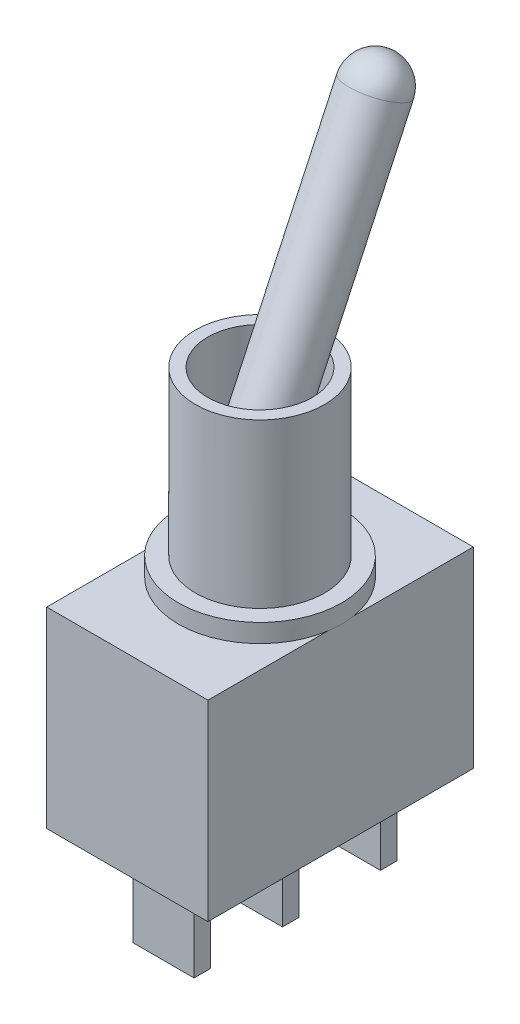
ISO-10303-21;
HEADER;
FILE_DESCRIPTION(('STEP AP214'),'2;1');
FILE_NAME('part.step','',(''),(''),'','','');
FILE_SCHEMA(('AUTOMOTIVE_DESIGN { 1 0 10303 214 1 1 1 1 }'));
ENDSEC;
DATA;
#1=APPLICATION_CONTEXT('core data for automotive mechanical design processes');
#2=APPLICATION_PROTOCOL_DEFINITION('international standard','automotive_design',2000,#1);
#3=PRODUCT_CONTEXT('',#1,'mechanical');
#4=PRODUCT('Part','Part','',(#3));
#5=PRODUCT_RELATED_PRODUCT_CATEGORY('part','',(#4));
#6=PRODUCT_DEFINITION_FORMATION('','',#4);
#7=PRODUCT_DEFINITION_CONTEXT('part definition',#1,'design');
#8=PRODUCT_DEFINITION('design','',#6,#7);
#9=PRODUCT_DEFINITION_SHAPE('','',#8);
#10=(LENGTH_UNIT() NAMED_UNIT(*) SI_UNIT(.MILLI.,.METRE.));
#11=(NAMED_UNIT(*) PLANE_ANGLE_UNIT() SI_UNIT($,.RADIAN.));
#12=(NAMED_UNIT(*) SI_UNIT($,.STERADIAN.) SOLID_ANGLE_UNIT());
#13=UNCERTAINTY_MEASURE_WITH_UNIT(LENGTH_MEASURE(1.E-05),#10,'distance_accuracy_value','');
#14=(GEOMETRIC_REPRESENTATION_CONTEXT(3) GLOBAL_UNCERTAINTY_ASSIGNED_CONTEXT((#13)) GLOBAL_UNIT_ASSIGNED_CONTEXT((#10,
#11,#12)) REPRESENTATION_CONTEXT('',''));
#15=CARTESIAN_POINT('',(0.,0.,0.));
#16=DIRECTION('',(0.,0.,1.));
#17=DIRECTION('',(1.,0.,0.));
#18=AXIS2_PLACEMENT_3D('',#15,#16,#17);
#19=CARTESIAN_POINT('',(0.,-10.3,0.));
#20=DIRECTION('',(0.,1.,0.));
#21=DIRECTION('',(0.,0.,1.));
#22=AXIS2_PLACEMENT_3D('',#19,#20,#21);
#23=PLANE('',#22);
#24=DIRECTION('',(0.,0.,1.));
#25=VECTOR('',#24,1.);
#26=CARTESIAN_POINT('',(1.5,-10.3,0.4));
#27=LINE('',#26,#25);
#28=CARTESIAN_POINT('',(1.5,-10.3,-0.4));
#29=VERTEX_POINT('',#28);
#30=CARTESIAN_POINT('',(1.5,-10.3,0.4));
#31=VERTEX_POINT('',#30);
#32=EDGE_CURVE('E223',#29,#31,#27,.T.);
#33=ORIENTED_EDGE('',*,*,#32,.F.);
#34=DIRECTION('',(1.,0.,0.));
#35=VECTOR('',#34,1.);
#36=CARTESIAN_POINT('',(-1.5,-10.3,-0.4));
#37=LINE('',#36,#35);
#38=CARTESIAN_POINT('',(-1.5,-10.3,-0.4));
#39=VERTEX_POINT('',#38);
#40=EDGE_CURVE('E228',#39,#29,#37,.T.);
#41=ORIENTED_EDGE('',*,*,#40,.F.);
#42=DIRECTION('',(0.,0.,-1.));
#43=VECTOR('',#42,1.);
#44=CARTESIAN_POINT('',(-1.5,-10.3,0.4));
#45=LINE('',#44,#43);
#46=CARTESIAN_POINT('',(-1.5,-10.3,0.4));
#47=VERTEX_POINT('',#46);
#48=EDGE_CURVE('E240',#47,#39,#45,.T.);
#49=ORIENTED_EDGE('',*,*,#48,.F.);
#50=DIRECTION('',(-1.,0.,0.));
#51=VECTOR('',#50,1.);
#52=CARTESIAN_POINT('',(-1.5,-10.3,0.4));
#53=LINE('',#52,#51);
#54=EDGE_CURVE('E237',#31,#47,#53,.T.);
#55=ORIENTED_EDGE('',*,*,#54,.F.);
#56=EDGE_LOOP('',(#33,#41,#49,#55));
#57=FACE_BOUND('',#56,.T.);
#58=DIRECTION('',(0.,0.,-1.));
#59=VECTOR('',#58,1.);
#60=CARTESIAN_POINT('',(-3.95,-10.3,6.5));
#61=LINE('',#60,#59);
#62=CARTESIAN_POINT('',(-3.95,-10.3,6.5));
#63=VERTEX_POINT('',#62);
#64=CARTESIAN_POINT('',(-3.95,-10.3,-6.5));
#65=VERTEX_POINT('',#64);
#66=EDGE_CURVE('E290',#63,#65,#61,.T.);
#67=ORIENTED_EDGE('',*,*,#66,.T.);
#68=DIRECTION('',(1.,0.,0.));
#69=VECTOR('',#68,1.);
#70=CARTESIAN_POINT('',(3.95,-10.3,-6.5));
#71=LINE('',#70,#69);
#72=CARTESIAN_POINT('',(3.95,-10.3,-6.5));
#73=VERTEX_POINT('',#72);
#74=EDGE_CURVE('E293',#65,#73,#71,.T.);
#75=ORIENTED_EDGE('',*,*,#74,.T.);
#76=DIRECTION('',(0.,0.,1.));
#77=VECTOR('',#76,1.);
#78=CARTESIAN_POINT('',(3.95,-10.3,6.5));
#79=LINE('',#78,#77);
#80=CARTESIAN_POINT('',(3.95,-10.3,6.5));
#81=VERTEX_POINT('',#80);
#82=EDGE_CURVE('E296',#73,#81,#79,.T.);
#83=ORIENTED_EDGE('',*,*,#82,.T.);
#84=DIRECTION('',(-1.,0.,0.));
#85=VECTOR('',#84,1.);
#86=CARTESIAN_POINT('',(3.95,-10.3,6.5));
#87=LINE('',#86,#85);
#88=EDGE_CURVE('E298',#81,#63,#87,.T.);
#89=ORIENTED_EDGE('',*,*,#88,.T.);
#90=EDGE_LOOP('',(#67,#75,#83,#89));
#91=FACE_BOUND('',#90,.T.);
#92=DIRECTION('',(0.,0.,1.));
#93=VECTOR('',#92,1.);
#94=CARTESIAN_POINT('',(1.5,-10.3,4.73035239529269));
#95=LINE('',#94,#93);
#96=CARTESIAN_POINT('',(1.5,-10.3,3.93035239529269));
#97=VERTEX_POINT('',#96);
#98=CARTESIAN_POINT('',(1.5,-10.3,4.73035239529269));
#99=VERTEX_POINT('',#98);
#100=EDGE_CURVE('E256',#97,#99,#95,.T.);
#101=ORIENTED_EDGE('',*,*,#100,.F.);
#102=DIRECTION('',(1.,0.,0.));
#103=VECTOR('',#102,1.);
#104=CARTESIAN_POINT('',(-1.5,-10.3,3.93035239529269));
#105=LINE('',#104,#103);
#106=CARTESIAN_POINT('',(-1.5,-10.3,3.93035239529269));
#107=VERTEX_POINT('',#106);
#108=EDGE_CURVE('E261',#107,#97,#105,.T.);
#109=ORIENTED_EDGE('',*,*,#108,.F.);
#110=DIRECTION('',(0.,0.,-1.));
#111=VECTOR('',#110,1.);
#112=CARTESIAN_POINT('',(-1.5,-10.3,4.73035239529269));
#113=LINE('',#112,#111);
#114=CARTESIAN_POINT('',(-1.5,-10.3,4.73035239529269));
#115=VERTEX_POINT('',#114);
#116=EDGE_CURVE('E273',#115,#107,#113,.T.);
#117=ORIENTED_EDGE('',*,*,#116,.F.);
#118=DIRECTION('',(-1.,0.,0.));
#119=VECTOR('',#118,1.);
#120=CARTESIAN_POINT('',(-1.5,-10.3,4.73035239529269));
#121=LINE('',#120,#119);
#122=EDGE_CURVE('E270',#99,#115,#121,.T.);
#123=ORIENTED_EDGE('',*,*,#122,.F.);
#124=EDGE_LOOP('',(#101,#109,#117,#123));
#125=FACE_BOUND('',#124,.T.);
#126=DIRECTION('',(0.,0.,1.));
#127=VECTOR('',#126,1.);
#128=CARTESIAN_POINT('',(1.5,-10.3,-4.40180205123181));
#129=LINE('',#128,#127);
#130=CARTESIAN_POINT('',(1.5,-10.3,-5.20180205123181));
#131=VERTEX_POINT('',#130);
#132=CARTESIAN_POINT('',(1.5,-10.3,-4.40180205123181));
#133=VERTEX_POINT('',#132);
#134=EDGE_CURVE('E177',#131,#133,#129,.T.);
#135=ORIENTED_EDGE('',*,*,#134,.F.);
#136=DIRECTION('',(1.,0.,0.));
#137=VECTOR('',#136,1.);
#138=CARTESIAN_POINT('',(-1.5,-10.3,-5.20180205123181));
#139=LINE('',#138,#137);
#140=CARTESIAN_POINT('',(-1.5,-10.3,-5.20180205123181));
#141=VERTEX_POINT('',#140);
#142=EDGE_CURVE('E198',#141,#131,#139,.T.);
#143=ORIENTED_EDGE('',*,*,#142,.F.);
#144=DIRECTION('',(0.,0.,-1.));
#145=VECTOR('',#144,1.);
#146=CARTESIAN_POINT('',(-1.5,-10.3,-4.40180205123181));
#147=LINE('',#146,#145);
#148=CARTESIAN_POINT('',(-1.5,-10.3,-4.40180205123181));
#149=VERTEX_POINT('',#148);
#150=EDGE_CURVE('E208',#149,#141,#147,.T.);
#151=ORIENTED_EDGE('',*,*,#150,.F.);
#152=DIRECTION('',(-1.,0.,0.));
#153=VECTOR('',#152,1.);
#154=CARTESIAN_POINT('',(-1.5,-10.3,-4.40180205123181));
#155=LINE('',#154,#153);
#156=EDGE_CURVE('E58',#133,#149,#155,.T.);
#157=ORIENTED_EDGE('',*,*,#156,.F.);
#158=EDGE_LOOP('',(#135,#143,#151,#157));
#159=FACE_BOUND('',#158,.T.);
#160=ADVANCED_FACE('F33',(#57,#91,#125,#159),#23,.F.);
#161=CARTESIAN_POINT('',(0.,-0.9,0.));
#162=DIRECTION('',(0.,-1.,0.));
#163=DIRECTION('',(0.,0.,-1.));
#164=AXIS2_PLACEMENT_3D('',#161,#162,#163);
#165=PLANE('',#164);
#166=DIRECTION('',(0.,0.,-1.));
#167=VECTOR('',#166,1.);
#168=CARTESIAN_POINT('',(-3.95,-0.9,6.5));
#169=LINE('',#168,#167);
#170=CARTESIAN_POINT('',(-3.95,-0.9,0.630476010645933));
#171=VERTEX_POINT('',#170);
#172=CARTESIAN_POINT('',(-3.95,-0.9,-0.630476010645934));
#173=VERTEX_POINT('',#172);
#174=EDGE_CURVE('E46',#171,#173,#169,.T.);
#175=ORIENTED_EDGE('',*,*,#174,.F.);
#176=CARTESIAN_POINT('',(0.,-0.9,0.));
#177=DIRECTION('',(0.,-1.,0.));
#178=DIRECTION('',(0.,0.,-1.));
#179=AXIS2_PLACEMENT_3D('',#176,#177,#178);
#180=CIRCLE('',#179,4.);
#181=EDGE_CURVE('E371',#171,#173,#180,.T.);
#182=ORIENTED_EDGE('',*,*,#181,.T.);
#183=EDGE_LOOP('',(#175,#182));
#184=FACE_BOUND('',#183,.T.);
#185=ADVANCED_FACE('F373',(#184),#165,.T.);
#186=CARTESIAN_POINT('',(0.,8.,0.));
#187=DIRECTION('',(0.,1.,0.));
#188=DIRECTION('',(0.,0.,1.));
#189=AXIS2_PLACEMENT_3D('',#186,#187,#188);
#190=PLANE('',#189);
#191=CARTESIAN_POINT('',(0.,8.,-1.398922974465));
#192=DIRECTION('',(0.,1.,0.));
#193=DIRECTION('',(0.,0.,-1.));
#194=AXIS2_PLACEMENT_3D('',#191,#192,#193);
#195=ELLIPSE('',#194,1.54472908654749,1.4);
#196=CARTESIAN_POINT('',(1.1394630748505,8.,-2.29641351806512));
#197=VERTEX_POINT('',#196);
#198=CARTESIAN_POINT('',(-1.1394630748505,8.,-2.29641351806512));
#199=VERTEX_POINT('',#198);
#200=EDGE_CURVE('E173',#197,#199,#195,.T.);
#201=ORIENTED_EDGE('',*,*,#200,.F.);
#202=CARTESIAN_POINT('',(0.,8.,0.));
#203=DIRECTION('',(0.,1.,0.));
#204=DIRECTION('',(0.,0.,1.));
#205=AXIS2_PLACEMENT_3D('',#202,#203,#204);
#206=CIRCLE('',#205,2.56357);
#207=EDGE_CURVE('E164',#199,#197,#206,.T.);
#208=ORIENTED_EDGE('',*,*,#207,.F.);
#209=EDGE_LOOP('',(#201,#208));
#210=FACE_BOUND('',#209,.T.);
#211=CARTESIAN_POINT('',(0.,8.,0.));
#212=DIRECTION('',(0.,1.,0.));
#213=DIRECTION('',(0.,0.,1.));
#214=AXIS2_PLACEMENT_3D('',#211,#212,#213);
#215=CIRCLE('',#214,3.16357);
#216=CARTESIAN_POINT('',(0.,8.,3.16357));
#217=VERTEX_POINT('',#216);
#218=EDGE_CURVE('E170',#217,#217,#215,.T.);
#219=ORIENTED_EDGE('',*,*,#218,.T.);
#220=EDGE_LOOP('',(#219));
#221=FACE_BOUND('',#220,.T.);
#222=ADVANCED_FACE('F174',(#210,#221),#190,.T.);
#223=CARTESIAN_POINT('',(0.,8.,0.));
#224=DIRECTION('',(0.,-1.,0.));
#225=DIRECTION('',(0.,0.,-1.));
#226=AXIS2_PLACEMENT_3D('',#223,#224,#225);
#227=CYLINDRICAL_SURFACE('',#226,3.16357);
#228=ORIENTED_EDGE('',*,*,#218,.F.);
#229=EDGE_LOOP('',(#228));
#230=FACE_BOUND('',#229,.T.);
#231=CARTESIAN_POINT('',(0.,0.,0.));
#232=DIRECTION('',(0.,-1.,0.));
#233=DIRECTION('',(0.,0.,-1.));
#234=AXIS2_PLACEMENT_3D('',#231,#232,#233);
#235=CIRCLE('',#234,3.16357);
#236=CARTESIAN_POINT('',(0.,0.,-3.16357));
#237=VERTEX_POINT('',#236);
#238=EDGE_CURVE('E326',#237,#237,#235,.T.);
#239=ORIENTED_EDGE('',*,*,#238,.F.);
#240=EDGE_LOOP('',(#239));
#241=FACE_BOUND('',#240,.T.);
#242=ADVANCED_FACE('F35',(#230,#241),#227,.T.);
#243=CARTESIAN_POINT('',(0.,8.,0.));
#244=DIRECTION('',(0.,-1.,0.));
#245=DIRECTION('',(0.,0.,-1.));
#246=AXIS2_PLACEMENT_3D('',#243,#244,#245);
#247=CYLINDRICAL_SURFACE('',#246,2.56357);
#248=CARTESIAN_POINT('',(-1.1394630748505,8.,-2.29641351806512));
#249=CARTESIAN_POINT('',(-1.12226827270815,7.96131736444431,-2.30493857180161));
#250=CARTESIAN_POINT('',(-1.1038901049141,7.92324768718584,-2.31382414280397));
#251=CARTESIAN_POINT('',(-1.06449779961533,7.84856342761104,-2.33221271820831));
#252=CARTESIAN_POINT('',(-1.04347888558669,7.81195164445421,-2.34171682600029));
#253=CARTESIAN_POINT('',(-0.975888177283611,7.70443228135152,-2.37106811798166));
#254=CARTESIAN_POINT('',(-0.924982479903859,7.63631125852949,-2.39164933037791));
#255=CARTESIAN_POINT('',(-0.822750588776976,7.52404485299656,-2.42842927129518));
#256=CARTESIAN_POINT('',(-0.773682329704692,7.47785340580067,-2.44465528273487));
#257=CARTESIAN_POINT('',(-0.668282249814375,7.39428761935084,-2.47553808822086));
#258=CARTESIAN_POINT('',(-0.611973766582887,7.3568859977715,-2.4901996585817));
#259=CARTESIAN_POINT('',(-0.492651350690235,7.29209095592104,-2.51653260863014));
#260=CARTESIAN_POINT('',(-0.429593131800477,7.26476961658452,-2.52818228066054));
#261=CARTESIAN_POINT('',(-0.298934411756676,7.22168109448528,-2.54693468283132));
#262=CARTESIAN_POINT('',(-0.231331757682915,7.20591943081837,-2.55403524082097));
#263=CARTESIAN_POINT('',(-0.101244553737832,7.18763783241573,-2.56231181247647));
#264=CARTESIAN_POINT('',(-0.0389615866485444,7.18390826368347,-2.56402850596738));
#265=CARTESIAN_POINT('',(0.0853546419817216,7.18637387954013,-2.56290159565313));
#266=CARTESIAN_POINT('',(0.147387977670522,7.19256585925628,-2.56005946444571));
#267=CARTESIAN_POINT('',(0.267241713805259,7.21428742966118,-2.550287960424));
#268=CARTESIAN_POINT('',(0.325133640688882,7.22949067868386,-2.54350158719142));
#269=CARTESIAN_POINT('',(0.43737718429277,7.26846162830131,-2.52662087880715));
#270=CARTESIAN_POINT('',(0.491731613502875,7.29222242452199,-2.51652921101604));
#271=CARTESIAN_POINT('',(0.59740466204986,7.34842368661777,-2.49359552704039));
#272=CARTESIAN_POINT('',(0.648571336836085,7.38111662399594,-2.48067611197517));
#273=CARTESIAN_POINT('',(0.745210715742571,7.45380329299459,-2.45338268669338));
#274=CARTESIAN_POINT('',(0.7906651676326,7.4938194718231,-2.43900426642421));
#275=CARTESIAN_POINT('',(0.865682818583732,7.56994866706548,-2.41323019808421));
#276=CARTESIAN_POINT('',(0.896504537293593,7.60486613126359,-2.40190323988882));
#277=CARTESIAN_POINT('',(0.954552395104911,7.67769281295424,-2.37943055055159));
#278=CARTESIAN_POINT('',(0.98177409056439,7.71560563725052,-2.36828505800089));
#279=CARTESIAN_POINT('',(1.03258939096979,7.79359889290867,-2.34657488886693));
#280=CARTESIAN_POINT('',(1.05620275030308,7.83366576947291,-2.33600726939871));
#281=CARTESIAN_POINT('',(1.10018002224675,7.91558765327592,-2.31561373800405));
#282=CARTESIAN_POINT('',(1.12055239636047,7.95743763016402,-2.30578593118771));
#283=CARTESIAN_POINT('',(1.1394630748505,8.00000000000001,-2.29641351806513));
#284=B_SPLINE_CURVE_WITH_KNOTS('',3,(#248,#249,#250,#251,#252,#253,#254,#255,#256,#257,#258,
#259,#260,#261,#262,#263,#264,#265,#266,#267,#268,#269,#270,#271,#272,#273,#274,#275,#276,#277,
#278,#279,#280,#281,#282,#283),.UNSPECIFIED.,.F.,.F.,(4,2,2,2,2,2,2,2,2,2,2,2,2,2,2,2,2,4),(0.,
0.129498195126758,0.259234090174244,0.520256731569084,0.727373709878902,0.933839076916279,
1.14175344261752,1.34976701124116,1.53608508293887,1.72234298203871,1.90223557452442,
2.08198335057287,2.26745929183861,2.45351357766242,2.59707917217262,2.74082035316078,
2.88374399835837,3.0262881504681),.UNSPECIFIED.);
#285=EDGE_CURVE('E11',#199,#197,#284,.T.);
#286=ORIENTED_EDGE('',*,*,#285,.F.);
#287=ORIENTED_EDGE('',*,*,#207,.T.);
#288=EDGE_LOOP('',(#286,#287));
#289=FACE_BOUND('',#288,.T.);
#290=CARTESIAN_POINT('',(0.,0.,0.));
#291=DIRECTION('',(0.,1.,0.));
#292=DIRECTION('',(0.,0.,1.));
#293=AXIS2_PLACEMENT_3D('',#290,#291,#292);
#294=CIRCLE('',#293,2.56357);
#295=CARTESIAN_POINT('',(0.,0.,2.56357));
#296=VERTEX_POINT('',#295);
#297=EDGE_CURVE('E171',#296,#296,#294,.T.);
#298=ORIENTED_EDGE('',*,*,#297,.F.);
#299=EDGE_LOOP('',(#298));
#300=FACE_BOUND('',#299,.T.);
#301=ADVANCED_FACE('F166',(#289,#300),#247,.F.);
#302=CARTESIAN_POINT('',(0.,0.,0.));
#303=DIRECTION('',(0.,-1.,0.));
#304=DIRECTION('',(0.,0.,-1.));
#305=AXIS2_PLACEMENT_3D('',#302,#303,#304);
#306=PLANE('',#305);
#307=ORIENTED_EDGE('',*,*,#297,.T.);
#308=EDGE_LOOP('',(#307));
#309=FACE_BOUND('',#308,.T.);
#310=ADVANCED_FACE('F640',(#309),#306,.F.);
#311=CARTESIAN_POINT('',(0.,0.,0.));
#312=DIRECTION('',(0.,-1.,0.));
#313=DIRECTION('',(0.,0.,-1.));
#314=AXIS2_PLACEMENT_3D('',#311,#312,#313);
#315=CIRCLE('',#314,4.);
#316=CARTESIAN_POINT('',(0.,0.,-4.));
#317=VERTEX_POINT('',#316);
#318=EDGE_CURVE('E323',#317,#317,#315,.T.);
#319=ORIENTED_EDGE('',*,*,#318,.F.);
#320=EDGE_LOOP('',(#319));
#321=FACE_BOUND('',#320,.T.);
#322=ORIENTED_EDGE('',*,*,#238,.T.);
#323=EDGE_LOOP('',(#322));
#324=FACE_BOUND('',#323,.T.);
#325=ADVANCED_FACE('F385',(#321,#324),#306,.F.);
#326=CARTESIAN_POINT('',(0.,-0.9,0.));
#327=DIRECTION('',(0.,1.,0.));
#328=DIRECTION('',(0.,0.,1.));
#329=AXIS2_PLACEMENT_3D('',#326,#327,#328);
#330=CYLINDRICAL_SURFACE('',#329,4.);
#331=CARTESIAN_POINT('',(3.95,-0.9,-0.630476010645922));
#332=VERTEX_POINT('',#331);
#333=CARTESIAN_POINT('',(3.95,-0.9,0.630476010645923));
#334=VERTEX_POINT('',#333);
#335=EDGE_CURVE('E324',#332,#334,#180,.T.);
#336=ORIENTED_EDGE('',*,*,#335,.F.);
#337=EDGE_CURVE('E328',#173,#332,#180,.T.);
#338=ORIENTED_EDGE('',*,*,#337,.F.);
#339=ORIENTED_EDGE('',*,*,#181,.F.);
#340=EDGE_CURVE('E327',#334,#171,#180,.T.);
#341=ORIENTED_EDGE('',*,*,#340,.F.);
#342=EDGE_LOOP('',(#336,#338,#339,#341));
#343=FACE_BOUND('',#342,.T.);
#344=ORIENTED_EDGE('',*,*,#318,.T.);
#345=EDGE_LOOP('',(#344));
#346=FACE_BOUND('',#345,.T.);
#347=ADVANCED_FACE('F374',(#343,#346),#330,.T.);
#348=DIRECTION('',(0.,0.,1.));
#349=VECTOR('',#348,1.);
#350=CARTESIAN_POINT('',(3.95,-0.9,6.5));
#351=LINE('',#350,#349);
#352=EDGE_CURVE('E310',#332,#334,#351,.T.);
#353=ORIENTED_EDGE('',*,*,#352,.F.);
#354=ORIENTED_EDGE('',*,*,#335,.T.);
#355=EDGE_LOOP('',(#353,#354));
#356=FACE_BOUND('',#355,.T.);
#357=ADVANCED_FACE('F377',(#356),#165,.T.);
#358=CARTESIAN_POINT('',(0.,-0.9,0.));
#359=DIRECTION('',(0.,1.,0.));
#360=DIRECTION('',(0.,0.,1.));
#361=AXIS2_PLACEMENT_3D('',#358,#359,#360);
#362=PLANE('',#361);
#363=CARTESIAN_POINT('',(3.95,-0.9,6.5));
#364=VERTEX_POINT('',#363);
#365=EDGE_CURVE('E306',#334,#364,#351,.T.);
#366=ORIENTED_EDGE('',*,*,#365,.F.);
#367=ORIENTED_EDGE('',*,*,#340,.T.);
#368=CARTESIAN_POINT('',(-3.95,-0.9,6.5));
#369=VERTEX_POINT('',#368);
#370=EDGE_CURVE('E301',#369,#171,#169,.T.);
#371=ORIENTED_EDGE('',*,*,#370,.F.);
#372=DIRECTION('',(-1.,0.,0.));
#373=VECTOR('',#372,1.);
#374=CARTESIAN_POINT('',(3.95,-0.9,6.5));
#375=LINE('',#374,#373);
#376=EDGE_CURVE('E294',#364,#369,#375,.T.);
#377=ORIENTED_EDGE('',*,*,#376,.F.);
#378=EDGE_LOOP('',(#366,#367,#371,#377));
#379=FACE_BOUND('',#378,.T.);
#380=ADVANCED_FACE('F351',(#379),#362,.T.);
#381=CARTESIAN_POINT('',(-3.95,-10.3,6.5));
#382=DIRECTION('',(1.,0.,0.));
#383=DIRECTION('',(0.,0.,-1.));
#384=AXIS2_PLACEMENT_3D('',#381,#382,#383);
#385=PLANE('',#384);
#386=ORIENTED_EDGE('',*,*,#370,.T.);
#387=ORIENTED_EDGE('',*,*,#174,.T.);
#388=CARTESIAN_POINT('',(-3.95,-0.9,-6.5));
#389=VERTEX_POINT('',#388);
#390=EDGE_CURVE('E289',#173,#389,#169,.T.);
#391=ORIENTED_EDGE('',*,*,#390,.T.);
#392=DIRECTION('',(0.,1.,0.));
#393=VECTOR('',#392,1.);
#394=CARTESIAN_POINT('',(-3.95,-10.3,-6.5));
#395=LINE('',#394,#393);
#396=EDGE_CURVE('E320',#65,#389,#395,.T.);
#397=ORIENTED_EDGE('',*,*,#396,.F.);
#398=ORIENTED_EDGE('',*,*,#66,.F.);
#399=DIRECTION('',(0.,1.,0.));
#400=VECTOR('',#399,1.);
#401=CARTESIAN_POINT('',(-3.95,-10.3,6.5));
#402=LINE('',#401,#400);
#403=EDGE_CURVE('E300',#63,#369,#402,.T.);
#404=ORIENTED_EDGE('',*,*,#403,.T.);
#405=EDGE_LOOP('',(#386,#387,#391,#397,#398,#404));
#406=FACE_BOUND('',#405,.T.);
#407=ADVANCED_FACE('F354',(#406),#385,.F.);
#408=CARTESIAN_POINT('',(3.95,-10.3,-6.5));
#409=DIRECTION('',(0.,0.,1.));
#410=DIRECTION('',(1.,0.,0.));
#411=AXIS2_PLACEMENT_3D('',#408,#409,#410);
#412=PLANE('',#411);
#413=DIRECTION('',(1.,0.,0.));
#414=VECTOR('',#413,1.);
#415=CARTESIAN_POINT('',(3.95,-0.9,-6.5));
#416=LINE('',#415,#414);
#417=CARTESIAN_POINT('',(3.95,-0.9,-6.5));
#418=VERTEX_POINT('',#417);
#419=EDGE_CURVE('E304',#389,#418,#416,.T.);
#420=ORIENTED_EDGE('',*,*,#419,.T.);
#421=DIRECTION('',(0.,1.,0.));
#422=VECTOR('',#421,1.);
#423=CARTESIAN_POINT('',(3.95,-10.3,-6.5));
#424=LINE('',#423,#422);
#425=EDGE_CURVE('E317',#73,#418,#424,.T.);
#426=ORIENTED_EDGE('',*,*,#425,.F.);
#427=ORIENTED_EDGE('',*,*,#74,.F.);
#428=ORIENTED_EDGE('',*,*,#396,.T.);
#429=EDGE_LOOP('',(#420,#426,#427,#428));
#430=FACE_BOUND('',#429,.T.);
#431=ADVANCED_FACE('F404',(#430),#412,.F.);
#432=CARTESIAN_POINT('',(3.95,-10.3,6.5));
#433=DIRECTION('',(-1.,0.,0.));
#434=DIRECTION('',(0.,0.,1.));
#435=AXIS2_PLACEMENT_3D('',#432,#433,#434);
#436=PLANE('',#435);
#437=EDGE_CURVE('E307',#418,#332,#351,.T.);
#438=ORIENTED_EDGE('',*,*,#437,.T.);
#439=ORIENTED_EDGE('',*,*,#352,.T.);
#440=ORIENTED_EDGE('',*,*,#365,.T.);
#441=DIRECTION('',(0.,1.,0.));
#442=VECTOR('',#441,1.);
#443=CARTESIAN_POINT('',(3.95,-10.3,6.5));
#444=LINE('',#443,#442);
#445=EDGE_CURVE('E314',#81,#364,#444,.T.);
#446=ORIENTED_EDGE('',*,*,#445,.F.);
#447=ORIENTED_EDGE('',*,*,#82,.F.);
#448=ORIENTED_EDGE('',*,*,#425,.T.);
#449=EDGE_LOOP('',(#438,#439,#440,#446,#447,#448));
#450=FACE_BOUND('',#449,.T.);
#451=ADVANCED_FACE('F341',(#450),#436,.F.);
#452=CARTESIAN_POINT('',(3.95,-10.3,6.5));
#453=DIRECTION('',(0.,0.,-1.));
#454=DIRECTION('',(-1.,0.,0.));
#455=AXIS2_PLACEMENT_3D('',#452,#453,#454);
#456=PLANE('',#455);
#457=ORIENTED_EDGE('',*,*,#376,.T.);
#458=ORIENTED_EDGE('',*,*,#403,.F.);
#459=ORIENTED_EDGE('',*,*,#88,.F.);
#460=ORIENTED_EDGE('',*,*,#445,.T.);
#461=EDGE_LOOP('',(#457,#458,#459,#460));
#462=FACE_BOUND('',#461,.T.);
#463=ADVANCED_FACE('F348',(#462),#456,.F.);
#464=ORIENTED_EDGE('',*,*,#390,.F.);
#465=ORIENTED_EDGE('',*,*,#337,.T.);
#466=ORIENTED_EDGE('',*,*,#437,.F.);
#467=ORIENTED_EDGE('',*,*,#419,.F.);
#468=EDGE_LOOP('',(#464,#465,#466,#467));
#469=FACE_BOUND('',#468,.T.);
#470=ADVANCED_FACE('F366',(#469),#362,.T.);
#471=CARTESIAN_POINT('',(1.5,-14.8,4.73035239529269));
#472=DIRECTION('',(-1.,0.,0.));
#473=DIRECTION('',(0.,0.,1.));
#474=AXIS2_PLACEMENT_3D('',#471,#472,#473);
#475=PLANE('',#474);
#476=ORIENTED_EDGE('',*,*,#100,.T.);
#477=DIRECTION('',(0.,1.,0.));
#478=VECTOR('',#477,1.);
#479=CARTESIAN_POINT('',(1.5,-14.8,4.73035239529269));
#480=LINE('',#479,#478);
#481=CARTESIAN_POINT('',(1.5,-14.8,4.73035239529269));
#482=VERTEX_POINT('',#481);
#483=EDGE_CURVE('E286',#482,#99,#480,.T.);
#484=ORIENTED_EDGE('',*,*,#483,.F.);
#485=DIRECTION('',(0.,0.,1.));
#486=VECTOR('',#485,1.);
#487=CARTESIAN_POINT('',(1.5,-14.8,4.73035239529269));
#488=LINE('',#487,#486);
#489=CARTESIAN_POINT('',(1.5,-14.8,3.93035239529269));
#490=VERTEX_POINT('',#489);
#491=EDGE_CURVE('E257',#490,#482,#488,.T.);
#492=ORIENTED_EDGE('',*,*,#491,.F.);
#493=DIRECTION('',(0.,1.,0.));
#494=VECTOR('',#493,1.);
#495=CARTESIAN_POINT('',(1.5,-14.8,3.93035239529269));
#496=LINE('',#495,#494);
#497=EDGE_CURVE('E267',#490,#97,#496,.T.);
#498=ORIENTED_EDGE('',*,*,#497,.T.);
#499=EDGE_LOOP('',(#476,#484,#492,#498));
#500=FACE_BOUND('',#499,.T.);
#501=ADVANCED_FACE('F396',(#500),#475,.F.);
#502=CARTESIAN_POINT('',(-1.5,-14.8,4.73035239529269));
#503=DIRECTION('',(0.,0.,-1.));
#504=DIRECTION('',(-1.,0.,0.));
#505=AXIS2_PLACEMENT_3D('',#502,#503,#504);
#506=PLANE('',#505);
#507=ORIENTED_EDGE('',*,*,#122,.T.);
#508=DIRECTION('',(0.,1.,0.));
#509=VECTOR('',#508,1.);
#510=CARTESIAN_POINT('',(-1.5,-14.8,4.73035239529269));
#511=LINE('',#510,#509);
#512=CARTESIAN_POINT('',(-1.5,-14.8,4.73035239529269));
#513=VERTEX_POINT('',#512);
#514=EDGE_CURVE('E283',#513,#115,#511,.T.);
#515=ORIENTED_EDGE('',*,*,#514,.F.);
#516=DIRECTION('',(-1.,0.,0.));
#517=VECTOR('',#516,1.);
#518=CARTESIAN_POINT('',(-1.5,-14.8,4.73035239529269));
#519=LINE('',#518,#517);
#520=EDGE_CURVE('E260',#482,#513,#519,.T.);
#521=ORIENTED_EDGE('',*,*,#520,.F.);
#522=ORIENTED_EDGE('',*,*,#483,.T.);
#523=EDGE_LOOP('',(#507,#515,#521,#522));
#524=FACE_BOUND('',#523,.T.);
#525=ADVANCED_FACE('F433',(#524),#506,.F.);
#526=CARTESIAN_POINT('',(-1.5,-14.8,4.73035239529269));
#527=DIRECTION('',(1.,0.,0.));
#528=DIRECTION('',(0.,0.,-1.));
#529=AXIS2_PLACEMENT_3D('',#526,#527,#528);
#530=PLANE('',#529);
#531=ORIENTED_EDGE('',*,*,#116,.T.);
#532=DIRECTION('',(0.,1.,0.));
#533=VECTOR('',#532,1.);
#534=CARTESIAN_POINT('',(-1.5,-14.8,3.93035239529269));
#535=LINE('',#534,#533);
#536=CARTESIAN_POINT('',(-1.5,-14.8,3.93035239529269));
#537=VERTEX_POINT('',#536);
#538=EDGE_CURVE('E280',#537,#107,#535,.T.);
#539=ORIENTED_EDGE('',*,*,#538,.F.);
#540=DIRECTION('',(0.,0.,-1.));
#541=VECTOR('',#540,1.);
#542=CARTESIAN_POINT('',(-1.5,-14.8,4.73035239529269));
#543=LINE('',#542,#541);
#544=EDGE_CURVE('E263',#513,#537,#543,.T.);
#545=ORIENTED_EDGE('',*,*,#544,.F.);
#546=ORIENTED_EDGE('',*,*,#514,.T.);
#547=EDGE_LOOP('',(#531,#539,#545,#546));
#548=FACE_BOUND('',#547,.T.);
#549=ADVANCED_FACE('F440',(#548),#530,.F.);
#550=CARTESIAN_POINT('',(-1.5,-14.8,3.93035239529269));
#551=DIRECTION('',(0.,0.,1.));
#552=DIRECTION('',(1.,0.,0.));
#553=AXIS2_PLACEMENT_3D('',#550,#551,#552);
#554=PLANE('',#553);
#555=ORIENTED_EDGE('',*,*,#108,.T.);
#556=ORIENTED_EDGE('',*,*,#497,.F.);
#557=DIRECTION('',(1.,0.,0.));
#558=VECTOR('',#557,1.);
#559=CARTESIAN_POINT('',(-1.5,-14.8,3.93035239529269));
#560=LINE('',#559,#558);
#561=EDGE_CURVE('E265',#537,#490,#560,.T.);
#562=ORIENTED_EDGE('',*,*,#561,.F.);
#563=ORIENTED_EDGE('',*,*,#538,.T.);
#564=EDGE_LOOP('',(#555,#556,#562,#563));
#565=FACE_BOUND('',#564,.T.);
#566=ADVANCED_FACE('F447',(#565),#554,.F.);
#567=CARTESIAN_POINT('',(0.,-14.8,0.));
#568=DIRECTION('',(0.,-1.,0.));
#569=DIRECTION('',(0.,0.,-1.));
#570=AXIS2_PLACEMENT_3D('',#567,#568,#569);
#571=PLANE('',#570);
#572=ORIENTED_EDGE('',*,*,#491,.T.);
#573=ORIENTED_EDGE('',*,*,#520,.T.);
#574=ORIENTED_EDGE('',*,*,#544,.T.);
#575=ORIENTED_EDGE('',*,*,#561,.T.);
#576=EDGE_LOOP('',(#572,#573,#574,#575));
#577=FACE_BOUND('',#576,.T.);
#578=ADVANCED_FACE('F455',(#577),#571,.T.);
#579=CARTESIAN_POINT('',(1.5,-14.8,0.4));
#580=DIRECTION('',(-1.,0.,0.));
#581=DIRECTION('',(0.,0.,1.));
#582=AXIS2_PLACEMENT_3D('',#579,#580,#581);
#583=PLANE('',#582);
#584=ORIENTED_EDGE('',*,*,#32,.T.);
#585=DIRECTION('',(0.,1.,0.));
#586=VECTOR('',#585,1.);
#587=CARTESIAN_POINT('',(1.5,-14.8,0.4));
#588=LINE('',#587,#586);
#589=CARTESIAN_POINT('',(1.5,-14.8,0.4));
#590=VERTEX_POINT('',#589);
#591=EDGE_CURVE('E253',#590,#31,#588,.T.);
#592=ORIENTED_EDGE('',*,*,#591,.F.);
#593=DIRECTION('',(0.,0.,1.));
#594=VECTOR('',#593,1.);
#595=CARTESIAN_POINT('',(1.5,-14.8,0.4));
#596=LINE('',#595,#594);
#597=CARTESIAN_POINT('',(1.5,-14.8,-0.4));
#598=VERTEX_POINT('',#597);
#599=EDGE_CURVE('E224',#598,#590,#596,.T.);
#600=ORIENTED_EDGE('',*,*,#599,.F.);
#601=DIRECTION('',(0.,1.,0.));
#602=VECTOR('',#601,1.);
#603=CARTESIAN_POINT('',(1.5,-14.8,-0.4));
#604=LINE('',#603,#602);
#605=EDGE_CURVE('E234',#598,#29,#604,.T.);
#606=ORIENTED_EDGE('',*,*,#605,.T.);
#607=EDGE_LOOP('',(#584,#592,#600,#606));
#608=FACE_BOUND('',#607,.T.);
#609=ADVANCED_FACE('F463',(#608),#583,.F.);
#610=CARTESIAN_POINT('',(-1.5,-14.8,0.4));
#611=DIRECTION('',(0.,0.,-1.));
#612=DIRECTION('',(-1.,0.,0.));
#613=AXIS2_PLACEMENT_3D('',#610,#611,#612);
#614=PLANE('',#613);
#615=ORIENTED_EDGE('',*,*,#54,.T.);
#616=DIRECTION('',(0.,1.,0.));
#617=VECTOR('',#616,1.);
#618=CARTESIAN_POINT('',(-1.5,-14.8,0.4));
#619=LINE('',#618,#617);
#620=CARTESIAN_POINT('',(-1.5,-14.8,0.4));
#621=VERTEX_POINT('',#620);
#622=EDGE_CURVE('E250',#621,#47,#619,.T.);
#623=ORIENTED_EDGE('',*,*,#622,.F.);
#624=DIRECTION('',(-1.,0.,0.));
#625=VECTOR('',#624,1.);
#626=CARTESIAN_POINT('',(-1.5,-14.8,0.4));
#627=LINE('',#626,#625);
#628=EDGE_CURVE('E227',#590,#621,#627,.T.);
#629=ORIENTED_EDGE('',*,*,#628,.F.);
#630=ORIENTED_EDGE('',*,*,#591,.T.);
#631=EDGE_LOOP('',(#615,#623,#629,#630));
#632=FACE_BOUND('',#631,.T.);
#633=ADVANCED_FACE('F471',(#632),#614,.F.);
#634=CARTESIAN_POINT('',(-1.5,-14.8,0.4));
#635=DIRECTION('',(1.,0.,0.));
#636=DIRECTION('',(0.,0.,-1.));
#637=AXIS2_PLACEMENT_3D('',#634,#635,#636);
#638=PLANE('',#637);
#639=ORIENTED_EDGE('',*,*,#48,.T.);
#640=DIRECTION('',(0.,1.,0.));
#641=VECTOR('',#640,1.);
#642=CARTESIAN_POINT('',(-1.5,-14.8,-0.4));
#643=LINE('',#642,#641);
#644=CARTESIAN_POINT('',(-1.5,-14.8,-0.4));
#645=VERTEX_POINT('',#644);
#646=EDGE_CURVE('E247',#645,#39,#643,.T.);
#647=ORIENTED_EDGE('',*,*,#646,.F.);
#648=DIRECTION('',(0.,0.,-1.));
#649=VECTOR('',#648,1.);
#650=CARTESIAN_POINT('',(-1.5,-14.8,0.4));
#651=LINE('',#650,#649);
#652=EDGE_CURVE('E230',#621,#645,#651,.T.);
#653=ORIENTED_EDGE('',*,*,#652,.F.);
#654=ORIENTED_EDGE('',*,*,#622,.T.);
#655=EDGE_LOOP('',(#639,#647,#653,#654));
#656=FACE_BOUND('',#655,.T.);
#657=ADVANCED_FACE('F479',(#656),#638,.F.);
#658=CARTESIAN_POINT('',(-1.5,-14.8,-0.4));
#659=DIRECTION('',(0.,0.,1.));
#660=DIRECTION('',(1.,0.,0.));
#661=AXIS2_PLACEMENT_3D('',#658,#659,#660);
#662=PLANE('',#661);
#663=ORIENTED_EDGE('',*,*,#40,.T.);
#664=ORIENTED_EDGE('',*,*,#605,.F.);
#665=DIRECTION('',(1.,0.,0.));
#666=VECTOR('',#665,1.);
#667=CARTESIAN_POINT('',(-1.5,-14.8,-0.4));
#668=LINE('',#667,#666);
#669=EDGE_CURVE('E232',#645,#598,#668,.T.);
#670=ORIENTED_EDGE('',*,*,#669,.F.);
#671=ORIENTED_EDGE('',*,*,#646,.T.);
#672=EDGE_LOOP('',(#663,#664,#670,#671));
#673=FACE_BOUND('',#672,.T.);
#674=ADVANCED_FACE('F487',(#673),#662,.F.);
#675=CARTESIAN_POINT('',(0.,-14.8,0.));
#676=DIRECTION('',(0.,-1.,0.));
#677=DIRECTION('',(0.,0.,-1.));
#678=AXIS2_PLACEMENT_3D('',#675,#676,#677);
#679=PLANE('',#678);
#680=ORIENTED_EDGE('',*,*,#599,.T.);
#681=ORIENTED_EDGE('',*,*,#628,.T.);
#682=ORIENTED_EDGE('',*,*,#652,.T.);
#683=ORIENTED_EDGE('',*,*,#669,.T.);
#684=EDGE_LOOP('',(#680,#681,#682,#683));
#685=FACE_BOUND('',#684,.T.);
#686=ADVANCED_FACE('F495',(#685),#679,.T.);
#687=CARTESIAN_POINT('',(1.5,-14.8,-4.40180205123181));
#688=DIRECTION('',(-1.,0.,0.));
#689=DIRECTION('',(0.,0.,1.));
#690=AXIS2_PLACEMENT_3D('',#687,#688,#689);
#691=PLANE('',#690);
#692=ORIENTED_EDGE('',*,*,#134,.T.);
#693=DIRECTION('',(0.,1.,0.));
#694=VECTOR('',#693,1.);
#695=CARTESIAN_POINT('',(1.5,-14.8,-4.40180205123181));
#696=LINE('',#695,#694);
#697=CARTESIAN_POINT('',(1.5,-14.8,-4.40180205123181));
#698=VERTEX_POINT('',#697);
#699=EDGE_CURVE('E221',#698,#133,#696,.T.);
#700=ORIENTED_EDGE('',*,*,#699,.F.);
#701=DIRECTION('',(0.,0.,1.));
#702=VECTOR('',#701,1.);
#703=CARTESIAN_POINT('',(1.5,-14.8,-4.40180205123181));
#704=LINE('',#703,#702);
#705=CARTESIAN_POINT('',(1.5,-14.8,-5.20180205123181));
#706=VERTEX_POINT('',#705);
#707=EDGE_CURVE('E194',#706,#698,#704,.T.);
#708=ORIENTED_EDGE('',*,*,#707,.F.);
#709=DIRECTION('',(0.,1.,0.));
#710=VECTOR('',#709,1.);
#711=CARTESIAN_POINT('',(1.5,-14.8,-5.20180205123181));
#712=LINE('',#711,#710);
#713=EDGE_CURVE('E204',#706,#131,#712,.T.);
#714=ORIENTED_EDGE('',*,*,#713,.T.);
#715=EDGE_LOOP('',(#692,#700,#708,#714));
#716=FACE_BOUND('',#715,.T.);
#717=ADVANCED_FACE('F503',(#716),#691,.F.);
#718=CARTESIAN_POINT('',(-1.5,-14.8,-4.40180205123181));
#719=DIRECTION('',(0.,0.,-1.));
#720=DIRECTION('',(-1.,0.,0.));
#721=AXIS2_PLACEMENT_3D('',#718,#719,#720);
#722=PLANE('',#721);
#723=ORIENTED_EDGE('',*,*,#156,.T.);
#724=DIRECTION('',(0.,1.,0.));
#725=VECTOR('',#724,1.);
#726=CARTESIAN_POINT('',(-1.5,-14.8,-4.40180205123181));
#727=LINE('',#726,#725);
#728=CARTESIAN_POINT('',(-1.5,-14.8,-4.40180205123181));
#729=VERTEX_POINT('',#728);
#730=EDGE_CURVE('E218',#729,#149,#727,.T.);
#731=ORIENTED_EDGE('',*,*,#730,.F.);
#732=DIRECTION('',(-1.,0.,0.));
#733=VECTOR('',#732,1.);
#734=CARTESIAN_POINT('',(-1.5,-14.8,-4.40180205123181));
#735=LINE('',#734,#733);
#736=EDGE_CURVE('E197',#698,#729,#735,.T.);
#737=ORIENTED_EDGE('',*,*,#736,.F.);
#738=ORIENTED_EDGE('',*,*,#699,.T.);
#739=EDGE_LOOP('',(#723,#731,#737,#738));
#740=FACE_BOUND('',#739,.T.);
#741=ADVANCED_FACE('F511',(#740),#722,.F.);
#742=CARTESIAN_POINT('',(-1.5,-14.8,-4.40180205123181));
#743=DIRECTION('',(1.,0.,0.));
#744=DIRECTION('',(0.,0.,-1.));
#745=AXIS2_PLACEMENT_3D('',#742,#743,#744);
#746=PLANE('',#745);
#747=ORIENTED_EDGE('',*,*,#150,.T.);
#748=DIRECTION('',(0.,1.,0.));
#749=VECTOR('',#748,1.);
#750=CARTESIAN_POINT('',(-1.5,-14.8,-5.20180205123181));
#751=LINE('',#750,#749);
#752=CARTESIAN_POINT('',(-1.5,-14.8,-5.20180205123181));
#753=VERTEX_POINT('',#752);
#754=EDGE_CURVE('E215',#753,#141,#751,.T.);
#755=ORIENTED_EDGE('',*,*,#754,.F.);
#756=DIRECTION('',(0.,0.,-1.));
#757=VECTOR('',#756,1.);
#758=CARTESIAN_POINT('',(-1.5,-14.8,-4.40180205123181));
#759=LINE('',#758,#757);
#760=EDGE_CURVE('E200',#729,#753,#759,.T.);
#761=ORIENTED_EDGE('',*,*,#760,.F.);
#762=ORIENTED_EDGE('',*,*,#730,.T.);
#763=EDGE_LOOP('',(#747,#755,#761,#762));
#764=FACE_BOUND('',#763,.T.);
#765=ADVANCED_FACE('F519',(#764),#746,.F.);
#766=CARTESIAN_POINT('',(-1.5,-14.8,-5.20180205123181));
#767=DIRECTION('',(0.,0.,1.));
#768=DIRECTION('',(1.,0.,0.));
#769=AXIS2_PLACEMENT_3D('',#766,#767,#768);
#770=PLANE('',#769);
#771=ORIENTED_EDGE('',*,*,#142,.T.);
#772=ORIENTED_EDGE('',*,*,#713,.F.);
#773=DIRECTION('',(1.,0.,0.));
#774=VECTOR('',#773,1.);
#775=CARTESIAN_POINT('',(-1.5,-14.8,-5.20180205123181));
#776=LINE('',#775,#774);
#777=EDGE_CURVE('E202',#753,#706,#776,.T.);
#778=ORIENTED_EDGE('',*,*,#777,.F.);
#779=ORIENTED_EDGE('',*,*,#754,.T.);
#780=EDGE_LOOP('',(#771,#772,#778,#779));
#781=FACE_BOUND('',#780,.T.);
#782=ADVANCED_FACE('F527',(#781),#770,.F.);
#783=CARTESIAN_POINT('',(0.,-14.8,0.));
#784=DIRECTION('',(0.,-1.,0.));
#785=DIRECTION('',(0.,0.,-1.));
#786=AXIS2_PLACEMENT_3D('',#783,#784,#785);
#787=PLANE('',#786);
#788=ORIENTED_EDGE('',*,*,#707,.T.);
#789=ORIENTED_EDGE('',*,*,#736,.T.);
#790=ORIENTED_EDGE('',*,*,#760,.T.);
#791=ORIENTED_EDGE('',*,*,#777,.T.);
#792=EDGE_LOOP('',(#788,#789,#790,#791));
#793=FACE_BOUND('',#792,.T.);
#794=ADVANCED_FACE('F535',(#793),#787,.T.);
#795=CARTESIAN_POINT('',(0.,17.1,-5.6423226636755));
#796=DIRECTION('',(0.,0.90630778703665,-0.4226182617407));
#797=DIRECTION('',(0.,-0.4226182617407,-0.90630778703665));
#798=AXIS2_PLACEMENT_3D('',#795,#796,#797);
#799=SPHERICAL_SURFACE('',#798,1.4);
#800=CARTESIAN_POINT('',(0.,17.1,-5.6423226636755));
#801=DIRECTION('',(0.,0.90630778703665,-0.4226182617407));
#802=DIRECTION('',(0.,0.4226182617407,0.90630778703665));
#803=AXIS2_PLACEMENT_3D('',#800,#801,#802);
#804=CIRCLE('',#803,1.4);
#805=CARTESIAN_POINT('',(0.,17.691665566437,-4.37349176182419));
#806=VERTEX_POINT('',#805);
#807=EDGE_CURVE('E189',#806,#806,#804,.T.);
#808=ORIENTED_EDGE('',*,*,#807,.T.);
#809=EDGE_LOOP('',(#808));
#810=FACE_BOUND('',#809,.T.);
#811=ADVANCED_FACE('F543',(#810),#799,.T.);
#812=CARTESIAN_POINT('',(0.,5.05152705291992,1.52070162716877));
#813=DIRECTION('',(0.,-0.90630778703665,0.4226182617407));
#814=DIRECTION('',(0.,-0.4226182617407,-0.90630778703665));
#815=AXIS2_PLACEMENT_3D('',#812,#813,#814);
#816=PLANE('',#815);
#817=CARTESIAN_POINT('',(0.,4.45986148648294,0.251870725317463));
#818=DIRECTION('',(0.,0.90630778703665,-0.4226182617407));
#819=DIRECTION('',(0.,0.4226182617407,0.90630778703665));
#820=AXIS2_PLACEMENT_3D('',#817,#818,#819);
#821=CIRCLE('',#820,1.4);
#822=CARTESIAN_POINT('',(0.,5.05152705291992,1.52070162716877));
#823=VERTEX_POINT('',#822);
#824=EDGE_CURVE('E178',#823,#823,#821,.T.);
#825=ORIENTED_EDGE('',*,*,#824,.F.);
#826=EDGE_LOOP('',(#825));
#827=FACE_BOUND('',#826,.T.);
#828=ADVANCED_FACE('F183',(#827),#816,.T.);
#829=CARTESIAN_POINT('',(0.,15.555621566259,-4.92216717293266));
#830=DIRECTION('',(0.,0.90630778703665,-0.4226182617407));
#831=DIRECTION('',(0.,0.4226182617407,0.90630778703665));
#832=AXIS2_PLACEMENT_3D('',#829,#830,#831);
#833=CYLINDRICAL_SURFACE('',#832,1.4);
#834=ORIENTED_EDGE('',*,*,#285,.T.);
#835=ORIENTED_EDGE('',*,*,#200,.T.);
#836=EDGE_LOOP('',(#834,#835));
#837=FACE_BOUND('',#836,.T.);
#838=ORIENTED_EDGE('',*,*,#824,.T.);
#839=EDGE_LOOP('',(#838));
#840=FACE_BOUND('',#839,.T.);
#841=ORIENTED_EDGE('',*,*,#807,.F.);
#842=EDGE_LOOP('',(#841));
#843=FACE_BOUND('',#842,.T.);
#844=ADVANCED_FACE('F180',(#837,#840,#843),#833,.T.);
#845=CLOSED_SHELL('',(#160,#185,#222,#242,#301,#310,#325,#347,#357,#380,#407,#431,#451,#463,
#470,#501,#525,#549,#566,#578,#609,#633,#657,#674,#686,#717,#741,#765,#782,#794,#811,#828,#844));
#846=MANIFOLD_SOLID_BREP('B2',#845);
#847=ADVANCED_BREP_SHAPE_REPRESENTATION('',(#18,#846),#14);
#848=SHAPE_DEFINITION_REPRESENTATION(#9,#847);
ENDSEC;
END-ISO-10303-21;
